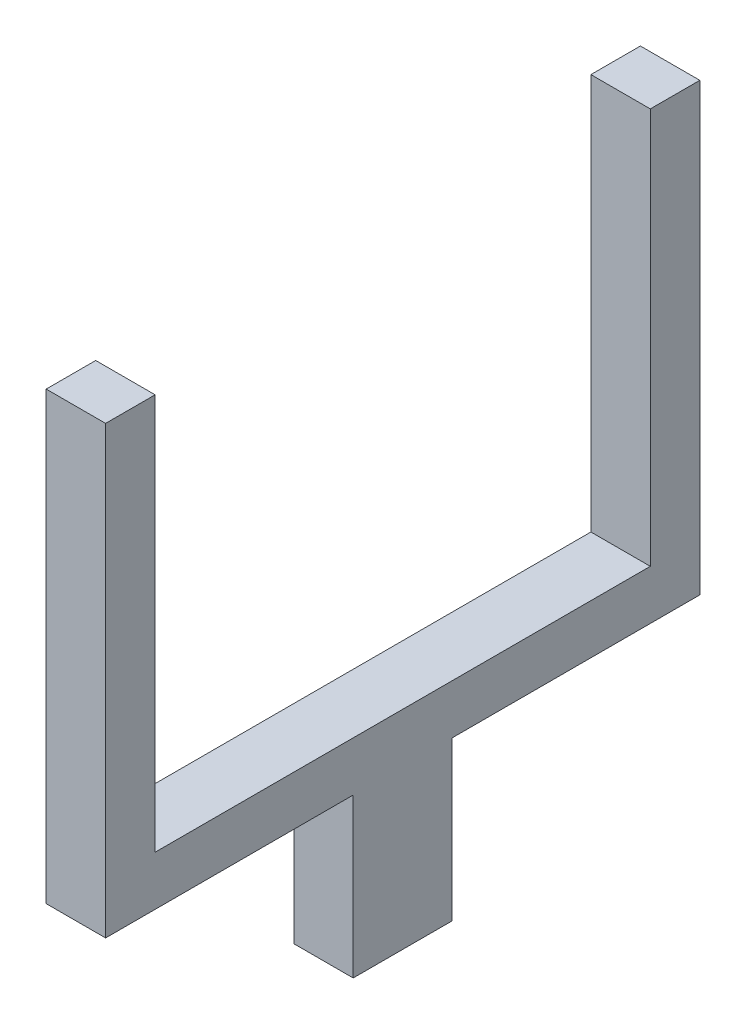
ISO-10303-21;
HEADER;
FILE_DESCRIPTION(('STEP AP214'),'2;1');
FILE_NAME('part.step','',(''),(''),'','','');
FILE_SCHEMA(('AUTOMOTIVE_DESIGN { 1 0 10303 214 1 1 1 1 }'));
ENDSEC;
DATA;
#1=APPLICATION_CONTEXT('core data for automotive mechanical design processes');
#2=APPLICATION_PROTOCOL_DEFINITION('international standard','automotive_design',2000,#1);
#3=PRODUCT_CONTEXT('',#1,'mechanical');
#4=PRODUCT('Part','Part','',(#3));
#5=PRODUCT_RELATED_PRODUCT_CATEGORY('part','',(#4));
#6=PRODUCT_DEFINITION_FORMATION('','',#4);
#7=PRODUCT_DEFINITION_CONTEXT('part definition',#1,'design');
#8=PRODUCT_DEFINITION('design','',#6,#7);
#9=PRODUCT_DEFINITION_SHAPE('','',#8);
#10=(LENGTH_UNIT() NAMED_UNIT(*) SI_UNIT(.MILLI.,.METRE.));
#11=(NAMED_UNIT(*) PLANE_ANGLE_UNIT() SI_UNIT($,.RADIAN.));
#12=(NAMED_UNIT(*) SI_UNIT($,.STERADIAN.) SOLID_ANGLE_UNIT());
#13=UNCERTAINTY_MEASURE_WITH_UNIT(LENGTH_MEASURE(1.E-05),#10,'distance_accuracy_value','');
#14=(GEOMETRIC_REPRESENTATION_CONTEXT(3) GLOBAL_UNCERTAINTY_ASSIGNED_CONTEXT((#13)) GLOBAL_UNIT_ASSIGNED_CONTEXT((#10,
#11,#12)) REPRESENTATION_CONTEXT('',''));
#15=CARTESIAN_POINT('',(0.,0.,0.));
#16=DIRECTION('',(0.,0.,1.));
#17=DIRECTION('',(1.,0.,0.));
#18=AXIS2_PLACEMENT_3D('',#15,#16,#17);
#19=CARTESIAN_POINT('',(3.,8.,15.));
#20=DIRECTION('',(0.,0.,-1.));
#21=DIRECTION('',(-1.,0.,0.));
#22=AXIS2_PLACEMENT_3D('',#19,#20,#21);
#23=PLANE('',#22);
#24=DIRECTION('',(0.,-1.,0.));
#25=VECTOR('',#24,1.);
#26=CARTESIAN_POINT('',(0.,8.,15.));
#27=LINE('',#26,#25);
#28=CARTESIAN_POINT('',(0.,30.5,15.));
#29=VERTEX_POINT('',#28);
#30=CARTESIAN_POINT('',(0.,8.,15.));
#31=VERTEX_POINT('',#30);
#32=EDGE_CURVE('E153',#29,#31,#27,.T.);
#33=ORIENTED_EDGE('',*,*,#32,.T.);
#34=DIRECTION('',(-1.,0.,0.));
#35=VECTOR('',#34,1.);
#36=CARTESIAN_POINT('',(3.,8.,15.));
#37=LINE('',#36,#35);
#38=CARTESIAN_POINT('',(3.,8.,15.));
#39=VERTEX_POINT('',#38);
#40=EDGE_CURVE('E11',#39,#31,#37,.T.);
#41=ORIENTED_EDGE('',*,*,#40,.F.);
#42=DIRECTION('',(0.,-1.,0.));
#43=VECTOR('',#42,1.);
#44=CARTESIAN_POINT('',(3.,8.,15.));
#45=LINE('',#44,#43);
#46=CARTESIAN_POINT('',(3.,30.5,15.));
#47=VERTEX_POINT('',#46);
#48=EDGE_CURVE('E175',#47,#39,#45,.T.);
#49=ORIENTED_EDGE('',*,*,#48,.F.);
#50=DIRECTION('',(-1.,0.,0.));
#51=VECTOR('',#50,1.);
#52=CARTESIAN_POINT('',(3.,30.5,15.));
#53=LINE('',#52,#51);
#54=EDGE_CURVE('E149',#47,#29,#53,.T.);
#55=ORIENTED_EDGE('',*,*,#54,.T.);
#56=EDGE_LOOP('',(#33,#41,#49,#55));
#57=FACE_BOUND('',#56,.T.);
#58=ADVANCED_FACE('F33',(#57),#23,.F.);
#59=CARTESIAN_POINT('',(3.,8.,2.5));
#60=DIRECTION('',(0.,1.,0.));
#61=DIRECTION('',(0.,0.,1.));
#62=AXIS2_PLACEMENT_3D('',#59,#60,#61);
#63=PLANE('',#62);
#64=DIRECTION('',(0.,0.,-1.));
#65=VECTOR('',#64,1.);
#66=CARTESIAN_POINT('',(0.,8.,2.5));
#67=LINE('',#66,#65);
#68=CARTESIAN_POINT('',(0.,8.,2.5));
#69=VERTEX_POINT('',#68);
#70=EDGE_CURVE('E156',#31,#69,#67,.T.);
#71=ORIENTED_EDGE('',*,*,#70,.T.);
#72=DIRECTION('',(-1.,0.,0.));
#73=VECTOR('',#72,1.);
#74=CARTESIAN_POINT('',(3.,8.,2.5));
#75=LINE('',#74,#73);
#76=CARTESIAN_POINT('',(3.,8.,2.5));
#77=VERTEX_POINT('',#76);
#78=EDGE_CURVE('E41',#77,#69,#75,.T.);
#79=ORIENTED_EDGE('',*,*,#78,.F.);
#80=DIRECTION('',(0.,0.,-1.));
#81=VECTOR('',#80,1.);
#82=CARTESIAN_POINT('',(3.,8.,2.5));
#83=LINE('',#82,#81);
#84=EDGE_CURVE('E104',#39,#77,#83,.T.);
#85=ORIENTED_EDGE('',*,*,#84,.F.);
#86=ORIENTED_EDGE('',*,*,#40,.T.);
#87=EDGE_LOOP('',(#71,#79,#85,#86));
#88=FACE_BOUND('',#87,.T.);
#89=ADVANCED_FACE('F253',(#88),#63,.F.);
#90=CARTESIAN_POINT('',(3.,0.,2.5));
#91=DIRECTION('',(0.,0.,-1.));
#92=DIRECTION('',(-1.,0.,0.));
#93=AXIS2_PLACEMENT_3D('',#90,#91,#92);
#94=PLANE('',#93);
#95=DIRECTION('',(0.,-1.,0.));
#96=VECTOR('',#95,1.);
#97=CARTESIAN_POINT('',(0.,0.,2.5));
#98=LINE('',#97,#96);
#99=CARTESIAN_POINT('',(0.,0.,2.5));
#100=VERTEX_POINT('',#99);
#101=EDGE_CURVE('E158',#69,#100,#98,.T.);
#102=ORIENTED_EDGE('',*,*,#101,.T.);
#103=DIRECTION('',(-1.,0.,0.));
#104=VECTOR('',#103,1.);
#105=CARTESIAN_POINT('',(3.,0.,2.5));
#106=LINE('',#105,#104);
#107=CARTESIAN_POINT('',(3.,0.,2.5));
#108=VERTEX_POINT('',#107);
#109=EDGE_CURVE('E194',#108,#100,#106,.T.);
#110=ORIENTED_EDGE('',*,*,#109,.F.);
#111=DIRECTION('',(0.,-1.,0.));
#112=VECTOR('',#111,1.);
#113=CARTESIAN_POINT('',(3.,0.,2.5));
#114=LINE('',#113,#112);
#115=EDGE_CURVE('E202',#77,#108,#114,.T.);
#116=ORIENTED_EDGE('',*,*,#115,.F.);
#117=ORIENTED_EDGE('',*,*,#78,.T.);
#118=EDGE_LOOP('',(#102,#110,#116,#117));
#119=FACE_BOUND('',#118,.T.);
#120=ADVANCED_FACE('F200',(#119),#94,.F.);
#121=CARTESIAN_POINT('',(3.,0.,-2.5));
#122=DIRECTION('',(0.,1.,0.));
#123=DIRECTION('',(0.,0.,1.));
#124=AXIS2_PLACEMENT_3D('',#121,#122,#123);
#125=PLANE('',#124);
#126=DIRECTION('',(0.,0.,-1.));
#127=VECTOR('',#126,1.);
#128=CARTESIAN_POINT('',(0.,0.,-2.5));
#129=LINE('',#128,#127);
#130=CARTESIAN_POINT('',(0.,0.,-2.5));
#131=VERTEX_POINT('',#130);
#132=EDGE_CURVE('E160',#100,#131,#129,.T.);
#133=ORIENTED_EDGE('',*,*,#132,.T.);
#134=DIRECTION('',(-1.,0.,0.));
#135=VECTOR('',#134,1.);
#136=CARTESIAN_POINT('',(3.,0.,-2.5));
#137=LINE('',#136,#135);
#138=CARTESIAN_POINT('',(3.,0.,-2.5));
#139=VERTEX_POINT('',#138);
#140=EDGE_CURVE('E191',#139,#131,#137,.T.);
#141=ORIENTED_EDGE('',*,*,#140,.F.);
#142=DIRECTION('',(0.,0.,-1.));
#143=VECTOR('',#142,1.);
#144=CARTESIAN_POINT('',(3.,0.,-2.5));
#145=LINE('',#144,#143);
#146=EDGE_CURVE('E220',#108,#139,#145,.T.);
#147=ORIENTED_EDGE('',*,*,#146,.F.);
#148=ORIENTED_EDGE('',*,*,#109,.T.);
#149=EDGE_LOOP('',(#133,#141,#147,#148));
#150=FACE_BOUND('',#149,.T.);
#151=ADVANCED_FACE('F211',(#150),#125,.F.);
#152=CARTESIAN_POINT('',(3.,0.,-2.5));
#153=DIRECTION('',(0.,0.,1.));
#154=DIRECTION('',(1.,0.,0.));
#155=AXIS2_PLACEMENT_3D('',#152,#153,#154);
#156=PLANE('',#155);
#157=DIRECTION('',(0.,1.,0.));
#158=VECTOR('',#157,1.);
#159=CARTESIAN_POINT('',(0.,0.,-2.5));
#160=LINE('',#159,#158);
#161=CARTESIAN_POINT('',(0.,8.,-2.5));
#162=VERTEX_POINT('',#161);
#163=EDGE_CURVE('E162',#131,#162,#160,.T.);
#164=ORIENTED_EDGE('',*,*,#163,.T.);
#165=DIRECTION('',(-1.,0.,0.));
#166=VECTOR('',#165,1.);
#167=CARTESIAN_POINT('',(3.,8.,-2.5));
#168=LINE('',#167,#166);
#169=CARTESIAN_POINT('',(3.,8.,-2.5));
#170=VERTEX_POINT('',#169);
#171=EDGE_CURVE('E188',#170,#162,#168,.T.);
#172=ORIENTED_EDGE('',*,*,#171,.F.);
#173=DIRECTION('',(0.,1.,0.));
#174=VECTOR('',#173,1.);
#175=CARTESIAN_POINT('',(3.,0.,-2.5));
#176=LINE('',#175,#174);
#177=EDGE_CURVE('E217',#139,#170,#176,.T.);
#178=ORIENTED_EDGE('',*,*,#177,.F.);
#179=ORIENTED_EDGE('',*,*,#140,.T.);
#180=EDGE_LOOP('',(#164,#172,#178,#179));
#181=FACE_BOUND('',#180,.T.);
#182=ADVANCED_FACE('F215',(#181),#156,.F.);
#183=CARTESIAN_POINT('',(3.,8.,-2.5));
#184=DIRECTION('',(0.,1.,0.));
#185=DIRECTION('',(0.,0.,1.));
#186=AXIS2_PLACEMENT_3D('',#183,#184,#185);
#187=PLANE('',#186);
#188=DIRECTION('',(0.,0.,-1.));
#189=VECTOR('',#188,1.);
#190=CARTESIAN_POINT('',(0.,8.,-2.5));
#191=LINE('',#190,#189);
#192=CARTESIAN_POINT('',(0.,8.,-15.));
#193=VERTEX_POINT('',#192);
#194=EDGE_CURVE('E164',#162,#193,#191,.T.);
#195=ORIENTED_EDGE('',*,*,#194,.T.);
#196=DIRECTION('',(-1.,0.,0.));
#197=VECTOR('',#196,1.);
#198=CARTESIAN_POINT('',(3.,8.,-15.));
#199=LINE('',#198,#197);
#200=CARTESIAN_POINT('',(3.,8.,-15.));
#201=VERTEX_POINT('',#200);
#202=EDGE_CURVE('E185',#201,#193,#199,.T.);
#203=ORIENTED_EDGE('',*,*,#202,.F.);
#204=DIRECTION('',(0.,0.,-1.));
#205=VECTOR('',#204,1.);
#206=CARTESIAN_POINT('',(3.,8.,-2.5));
#207=LINE('',#206,#205);
#208=EDGE_CURVE('E219',#170,#201,#207,.T.);
#209=ORIENTED_EDGE('',*,*,#208,.F.);
#210=ORIENTED_EDGE('',*,*,#171,.T.);
#211=EDGE_LOOP('',(#195,#203,#209,#210));
#212=FACE_BOUND('',#211,.T.);
#213=ADVANCED_FACE('F266',(#212),#187,.F.);
#214=CARTESIAN_POINT('',(3.,8.,-15.));
#215=DIRECTION('',(0.,0.,1.));
#216=DIRECTION('',(1.,0.,0.));
#217=AXIS2_PLACEMENT_3D('',#214,#215,#216);
#218=PLANE('',#217);
#219=DIRECTION('',(0.,1.,0.));
#220=VECTOR('',#219,1.);
#221=CARTESIAN_POINT('',(0.,8.,-15.));
#222=LINE('',#221,#220);
#223=CARTESIAN_POINT('',(0.,30.5,-15.));
#224=VERTEX_POINT('',#223);
#225=EDGE_CURVE('E166',#193,#224,#222,.T.);
#226=ORIENTED_EDGE('',*,*,#225,.T.);
#227=DIRECTION('',(-1.,0.,0.));
#228=VECTOR('',#227,1.);
#229=CARTESIAN_POINT('',(3.,30.5,-15.));
#230=LINE('',#229,#228);
#231=CARTESIAN_POINT('',(3.,30.5,-15.));
#232=VERTEX_POINT('',#231);
#233=EDGE_CURVE('E182',#232,#224,#230,.T.);
#234=ORIENTED_EDGE('',*,*,#233,.F.);
#235=DIRECTION('',(0.,1.,0.));
#236=VECTOR('',#235,1.);
#237=CARTESIAN_POINT('',(3.,8.,-15.));
#238=LINE('',#237,#236);
#239=EDGE_CURVE('E222',#201,#232,#238,.T.);
#240=ORIENTED_EDGE('',*,*,#239,.F.);
#241=ORIENTED_EDGE('',*,*,#202,.T.);
#242=EDGE_LOOP('',(#226,#234,#240,#241));
#243=FACE_BOUND('',#242,.T.);
#244=ADVANCED_FACE('F269',(#243),#218,.F.);
#245=CARTESIAN_POINT('',(3.,30.5,-15.));
#246=DIRECTION('',(0.,-1.,0.));
#247=DIRECTION('',(0.,0.,-1.));
#248=AXIS2_PLACEMENT_3D('',#245,#246,#247);
#249=PLANE('',#248);
#250=DIRECTION('',(0.,0.,1.));
#251=VECTOR('',#250,1.);
#252=CARTESIAN_POINT('',(0.,30.5,-15.));
#253=LINE('',#252,#251);
#254=CARTESIAN_POINT('',(0.,30.5,-12.5));
#255=VERTEX_POINT('',#254);
#256=EDGE_CURVE('E168',#224,#255,#253,.T.);
#257=ORIENTED_EDGE('',*,*,#256,.T.);
#258=DIRECTION('',(-1.,0.,0.));
#259=VECTOR('',#258,1.);
#260=CARTESIAN_POINT('',(3.,30.5,-12.5));
#261=LINE('',#260,#259);
#262=CARTESIAN_POINT('',(3.,30.5,-12.5));
#263=VERTEX_POINT('',#262);
#264=EDGE_CURVE('E179',#263,#255,#261,.T.);
#265=ORIENTED_EDGE('',*,*,#264,.F.);
#266=DIRECTION('',(0.,0.,1.));
#267=VECTOR('',#266,1.);
#268=CARTESIAN_POINT('',(3.,30.5,-15.));
#269=LINE('',#268,#267);
#270=EDGE_CURVE('E228',#232,#263,#269,.T.);
#271=ORIENTED_EDGE('',*,*,#270,.F.);
#272=ORIENTED_EDGE('',*,*,#233,.T.);
#273=EDGE_LOOP('',(#257,#265,#271,#272));
#274=FACE_BOUND('',#273,.T.);
#275=ADVANCED_FACE('F234',(#274),#249,.F.);
#276=CARTESIAN_POINT('',(3.,30.5,-12.5));
#277=DIRECTION('',(0.,0.,-1.));
#278=DIRECTION('',(0.,1.,0.));
#279=AXIS2_PLACEMENT_3D('',#276,#277,#278);
#280=PLANE('',#279);
#281=DIRECTION('',(0.,-1.,0.));
#282=VECTOR('',#281,1.);
#283=CARTESIAN_POINT('',(0.,30.5,-12.5));
#284=LINE('',#283,#282);
#285=CARTESIAN_POINT('',(0.,10.5,-12.5));
#286=VERTEX_POINT('',#285);
#287=EDGE_CURVE('E170',#255,#286,#284,.T.);
#288=ORIENTED_EDGE('',*,*,#287,.T.);
#289=DIRECTION('',(-1.,0.,0.));
#290=VECTOR('',#289,1.);
#291=CARTESIAN_POINT('',(3.,10.5,-12.5));
#292=LINE('',#291,#290);
#293=CARTESIAN_POINT('',(3.,10.5,-12.5));
#294=VERTEX_POINT('',#293);
#295=EDGE_CURVE('E144',#294,#286,#292,.T.);
#296=ORIENTED_EDGE('',*,*,#295,.F.);
#297=DIRECTION('',(0.,-1.,0.));
#298=VECTOR('',#297,1.);
#299=CARTESIAN_POINT('',(3.,30.5,-12.5));
#300=LINE('',#299,#298);
#301=EDGE_CURVE('E135',#263,#294,#300,.T.);
#302=ORIENTED_EDGE('',*,*,#301,.F.);
#303=ORIENTED_EDGE('',*,*,#264,.T.);
#304=EDGE_LOOP('',(#288,#296,#302,#303));
#305=FACE_BOUND('',#304,.T.);
#306=ADVANCED_FACE('F238',(#305),#280,.F.);
#307=CARTESIAN_POINT('',(3.,10.5,12.5));
#308=DIRECTION('',(0.,-1.,0.));
#309=DIRECTION('',(0.,0.,-1.));
#310=AXIS2_PLACEMENT_3D('',#307,#308,#309);
#311=PLANE('',#310);
#312=DIRECTION('',(0.,0.,1.));
#313=VECTOR('',#312,1.);
#314=CARTESIAN_POINT('',(0.,10.5,12.5));
#315=LINE('',#314,#313);
#316=CARTESIAN_POINT('',(0.,10.5,12.5));
#317=VERTEX_POINT('',#316);
#318=EDGE_CURVE('E143',#286,#317,#315,.T.);
#319=ORIENTED_EDGE('',*,*,#318,.T.);
#320=DIRECTION('',(-1.,0.,0.));
#321=VECTOR('',#320,1.);
#322=CARTESIAN_POINT('',(3.,10.5,12.5));
#323=LINE('',#322,#321);
#324=CARTESIAN_POINT('',(3.,10.5,12.5));
#325=VERTEX_POINT('',#324);
#326=EDGE_CURVE('E140',#325,#317,#323,.T.);
#327=ORIENTED_EDGE('',*,*,#326,.F.);
#328=DIRECTION('',(0.,0.,1.));
#329=VECTOR('',#328,1.);
#330=CARTESIAN_POINT('',(3.,10.5,12.5));
#331=LINE('',#330,#329);
#332=EDGE_CURVE('E129',#294,#325,#331,.T.);
#333=ORIENTED_EDGE('',*,*,#332,.F.);
#334=ORIENTED_EDGE('',*,*,#295,.T.);
#335=EDGE_LOOP('',(#319,#327,#333,#334));
#336=FACE_BOUND('',#335,.T.);
#337=ADVANCED_FACE('F141',(#336),#311,.F.);
#338=CARTESIAN_POINT('',(3.,30.5,12.5));
#339=DIRECTION('',(0.,0.,1.));
#340=DIRECTION('',(0.,-1.,0.));
#341=AXIS2_PLACEMENT_3D('',#338,#339,#340);
#342=PLANE('',#341);
#343=DIRECTION('',(0.,1.,0.));
#344=VECTOR('',#343,1.);
#345=CARTESIAN_POINT('',(0.,30.5,12.5));
#346=LINE('',#345,#344);
#347=CARTESIAN_POINT('',(0.,30.5,12.5));
#348=VERTEX_POINT('',#347);
#349=EDGE_CURVE('E90',#317,#348,#346,.T.);
#350=ORIENTED_EDGE('',*,*,#349,.T.);
#351=DIRECTION('',(-1.,0.,0.));
#352=VECTOR('',#351,1.);
#353=CARTESIAN_POINT('',(3.,30.5,12.5));
#354=LINE('',#353,#352);
#355=CARTESIAN_POINT('',(3.,30.5,12.5));
#356=VERTEX_POINT('',#355);
#357=EDGE_CURVE('E145',#356,#348,#354,.T.);
#358=ORIENTED_EDGE('',*,*,#357,.F.);
#359=DIRECTION('',(0.,1.,0.));
#360=VECTOR('',#359,1.);
#361=CARTESIAN_POINT('',(3.,30.5,12.5));
#362=LINE('',#361,#360);
#363=EDGE_CURVE('E133',#325,#356,#362,.T.);
#364=ORIENTED_EDGE('',*,*,#363,.F.);
#365=ORIENTED_EDGE('',*,*,#326,.T.);
#366=EDGE_LOOP('',(#350,#358,#364,#365));
#367=FACE_BOUND('',#366,.T.);
#368=ADVANCED_FACE('F147',(#367),#342,.F.);
#369=CARTESIAN_POINT('',(3.,30.5,15.));
#370=DIRECTION('',(0.,-1.,0.));
#371=DIRECTION('',(0.,0.,-1.));
#372=AXIS2_PLACEMENT_3D('',#369,#370,#371);
#373=PLANE('',#372);
#374=DIRECTION('',(0.,0.,1.));
#375=VECTOR('',#374,1.);
#376=CARTESIAN_POINT('',(0.,30.5,15.));
#377=LINE('',#376,#375);
#378=EDGE_CURVE('E96',#348,#29,#377,.T.);
#379=ORIENTED_EDGE('',*,*,#378,.T.);
#380=ORIENTED_EDGE('',*,*,#54,.F.);
#381=DIRECTION('',(0.,0.,1.));
#382=VECTOR('',#381,1.);
#383=CARTESIAN_POINT('',(3.,30.5,15.));
#384=LINE('',#383,#382);
#385=EDGE_CURVE('E49',#356,#47,#384,.T.);
#386=ORIENTED_EDGE('',*,*,#385,.F.);
#387=ORIENTED_EDGE('',*,*,#357,.T.);
#388=EDGE_LOOP('',(#379,#380,#386,#387));
#389=FACE_BOUND('',#388,.T.);
#390=ADVANCED_FACE('F242',(#389),#373,.F.);
#391=CARTESIAN_POINT('',(3.,0.,0.));
#392=DIRECTION('',(-1.,0.,0.));
#393=DIRECTION('',(0.,0.,1.));
#394=AXIS2_PLACEMENT_3D('',#391,#392,#393);
#395=PLANE('',#394);
#396=ORIENTED_EDGE('',*,*,#48,.T.);
#397=ORIENTED_EDGE('',*,*,#84,.T.);
#398=ORIENTED_EDGE('',*,*,#115,.T.);
#399=ORIENTED_EDGE('',*,*,#146,.T.);
#400=ORIENTED_EDGE('',*,*,#177,.T.);
#401=ORIENTED_EDGE('',*,*,#208,.T.);
#402=ORIENTED_EDGE('',*,*,#239,.T.);
#403=ORIENTED_EDGE('',*,*,#270,.T.);
#404=ORIENTED_EDGE('',*,*,#301,.T.);
#405=ORIENTED_EDGE('',*,*,#332,.T.);
#406=ORIENTED_EDGE('',*,*,#363,.T.);
#407=ORIENTED_EDGE('',*,*,#385,.T.);
#408=EDGE_LOOP('',(#396,#397,#398,#399,#400,#401,#402,#403,#404,#405,#406,#407));
#409=FACE_BOUND('',#408,.T.);
#410=ADVANCED_FACE('F131',(#409),#395,.F.);
#411=CARTESIAN_POINT('',(0.,0.,0.));
#412=DIRECTION('',(-1.,0.,0.));
#413=DIRECTION('',(0.,0.,1.));
#414=AXIS2_PLACEMENT_3D('',#411,#412,#413);
#415=PLANE('',#414);
#416=ORIENTED_EDGE('',*,*,#32,.F.);
#417=ORIENTED_EDGE('',*,*,#378,.F.);
#418=ORIENTED_EDGE('',*,*,#349,.F.);
#419=ORIENTED_EDGE('',*,*,#318,.F.);
#420=ORIENTED_EDGE('',*,*,#287,.F.);
#421=ORIENTED_EDGE('',*,*,#256,.F.);
#422=ORIENTED_EDGE('',*,*,#225,.F.);
#423=ORIENTED_EDGE('',*,*,#194,.F.);
#424=ORIENTED_EDGE('',*,*,#163,.F.);
#425=ORIENTED_EDGE('',*,*,#132,.F.);
#426=ORIENTED_EDGE('',*,*,#101,.F.);
#427=ORIENTED_EDGE('',*,*,#70,.F.);
#428=EDGE_LOOP('',(#416,#417,#418,#419,#420,#421,#422,#423,#424,#425,#426,#427));
#429=FACE_BOUND('',#428,.T.);
#430=ADVANCED_FACE('F206',(#429),#415,.T.);
#431=CLOSED_SHELL('',(#58,#89,#120,#151,#182,#213,#244,#275,#306,#337,#368,#390,#410,#430));
#432=MANIFOLD_SOLID_BREP('B2',#431);
#433=ADVANCED_BREP_SHAPE_REPRESENTATION('',(#18,#432),#14);
#434=SHAPE_DEFINITION_REPRESENTATION(#9,#433);
ENDSEC;
END-ISO-10303-21;
